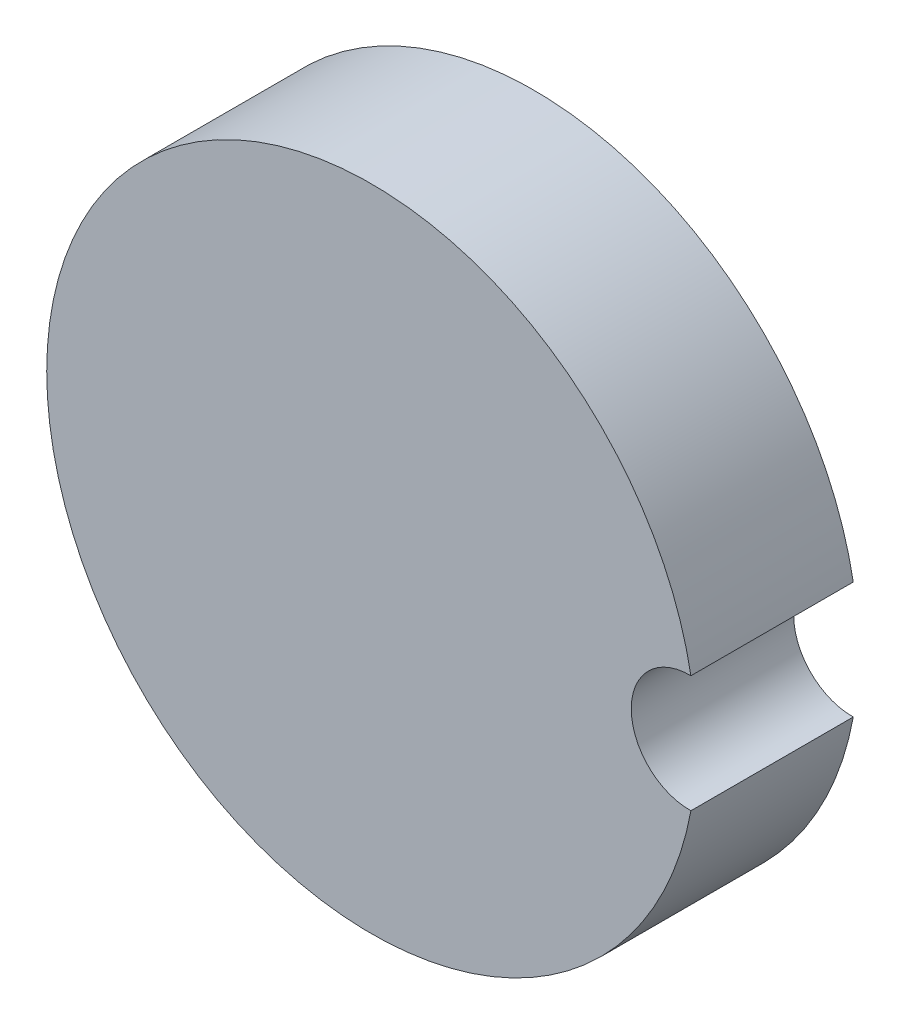
ISO-10303-21;
HEADER;
FILE_DESCRIPTION(('STEP AP214'),'2;1');
FILE_NAME('part.step','',(''),(''),'','','');
FILE_SCHEMA(('AUTOMOTIVE_DESIGN { 1 0 10303 214 1 1 1 1 }'));
ENDSEC;
DATA;
#1=APPLICATION_CONTEXT('core data for automotive mechanical design processes');
#2=APPLICATION_PROTOCOL_DEFINITION('international standard','automotive_design',2000,#1);
#3=PRODUCT_CONTEXT('',#1,'mechanical');
#4=PRODUCT('Part','Part','',(#3));
#5=PRODUCT_RELATED_PRODUCT_CATEGORY('part','',(#4));
#6=PRODUCT_DEFINITION_FORMATION('','',#4);
#7=PRODUCT_DEFINITION_CONTEXT('part definition',#1,'design');
#8=PRODUCT_DEFINITION('design','',#6,#7);
#9=PRODUCT_DEFINITION_SHAPE('','',#8);
#10=(LENGTH_UNIT() NAMED_UNIT(*) SI_UNIT(.MILLI.,.METRE.));
#11=(NAMED_UNIT(*) PLANE_ANGLE_UNIT() SI_UNIT($,.RADIAN.));
#12=(NAMED_UNIT(*) SI_UNIT($,.STERADIAN.) SOLID_ANGLE_UNIT());
#13=UNCERTAINTY_MEASURE_WITH_UNIT(LENGTH_MEASURE(1.E-05),#10,'distance_accuracy_value','');
#14=(GEOMETRIC_REPRESENTATION_CONTEXT(3) GLOBAL_UNCERTAINTY_ASSIGNED_CONTEXT((#13)) GLOBAL_UNIT_ASSIGNED_CONTEXT((#10,
#11,#12)) REPRESENTATION_CONTEXT('',''));
#15=CARTESIAN_POINT('',(0.,0.,0.));
#16=DIRECTION('',(0.,0.,1.));
#17=DIRECTION('',(1.,0.,0.));
#18=AXIS2_PLACEMENT_3D('',#15,#16,#17);
#19=CARTESIAN_POINT('',(0.,0.,50.));
#20=DIRECTION('',(0.,0.,-1.));
#21=DIRECTION('',(-1.,0.,0.));
#22=AXIS2_PLACEMENT_3D('',#19,#20,#21);
#23=CYLINDRICAL_SURFACE('',#22,100.);
#24=CARTESIAN_POINT('',(0.,0.,0.));
#25=DIRECTION('',(0.,0.,1.));
#26=DIRECTION('',(1.,0.,0.));
#27=AXIS2_PLACEMENT_3D('',#24,#25,#26);
#28=CIRCLE('',#27,100.);
#29=CARTESIAN_POINT('',(98.3673469387755,17.9962511714683,0.));
#30=VERTEX_POINT('',#29);
#31=CARTESIAN_POINT('',(98.3673469387755,-17.9962511714683,0.));
#32=VERTEX_POINT('',#31);
#33=EDGE_CURVE('E45',#30,#32,#28,.T.);
#34=ORIENTED_EDGE('',*,*,#33,.T.);
#35=DIRECTION('',(0.,0.,1.));
#36=VECTOR('',#35,1.);
#37=CARTESIAN_POINT('',(98.3673469387755,-17.9962511714683,25.));
#38=LINE('',#37,#36);
#39=CARTESIAN_POINT('',(98.3673469387755,-17.9962511714683,50.));
#40=VERTEX_POINT('',#39);
#41=EDGE_CURVE('E61',#32,#40,#38,.T.);
#42=ORIENTED_EDGE('',*,*,#41,.T.);
#43=CARTESIAN_POINT('',(0.,0.,50.));
#44=DIRECTION('',(0.,0.,1.));
#45=DIRECTION('',(1.,0.,0.));
#46=AXIS2_PLACEMENT_3D('',#43,#44,#45);
#47=CIRCLE('',#46,100.);
#48=CARTESIAN_POINT('',(98.3673469387755,17.9962511714683,50.));
#49=VERTEX_POINT('',#48);
#50=EDGE_CURVE('E11',#49,#40,#47,.T.);
#51=ORIENTED_EDGE('',*,*,#50,.F.);
#52=DIRECTION('',(0.,0.,1.));
#53=VECTOR('',#52,1.);
#54=CARTESIAN_POINT('',(98.3673469387755,17.9962511714683,25.));
#55=LINE('',#54,#53);
#56=EDGE_CURVE('E66',#49,#30,#55,.F.);
#57=ORIENTED_EDGE('',*,*,#56,.T.);
#58=EDGE_LOOP('',(#34,#42,#51,#57));
#59=FACE_BOUND('',#58,.T.);
#60=ADVANCED_FACE('F39',(#59),#23,.T.);
#61=CARTESIAN_POINT('',(0.,0.,50.));
#62=DIRECTION('',(0.,0.,1.));
#63=DIRECTION('',(1.,0.,0.));
#64=AXIS2_PLACEMENT_3D('',#61,#62,#63);
#65=PLANE('',#64);
#66=CARTESIAN_POINT('',(98.,0.,50.));
#67=DIRECTION('',(0.,0.,1.));
#68=DIRECTION('',(1.,0.,0.));
#69=AXIS2_PLACEMENT_3D('',#66,#67,#68);
#70=CIRCLE('',#69,18.);
#71=EDGE_CURVE('E59',#49,#40,#70,.T.);
#72=ORIENTED_EDGE('',*,*,#71,.F.);
#73=ORIENTED_EDGE('',*,*,#50,.T.);
#74=EDGE_LOOP('',(#72,#73));
#75=FACE_BOUND('',#74,.T.);
#76=ADVANCED_FACE('F77',(#75),#65,.T.);
#77=CARTESIAN_POINT('',(0.,0.,0.));
#78=DIRECTION('',(0.,0.,1.));
#79=DIRECTION('',(1.,0.,0.));
#80=AXIS2_PLACEMENT_3D('',#77,#78,#79);
#81=PLANE('',#80);
#82=ORIENTED_EDGE('',*,*,#33,.F.);
#83=CARTESIAN_POINT('',(98.,0.,0.));
#84=DIRECTION('',(0.,0.,1.));
#85=DIRECTION('',(1.,0.,0.));
#86=AXIS2_PLACEMENT_3D('',#83,#84,#85);
#87=CIRCLE('',#86,18.);
#88=EDGE_CURVE('E52',#30,#32,#87,.T.);
#89=ORIENTED_EDGE('',*,*,#88,.T.);
#90=EDGE_LOOP('',(#82,#89));
#91=FACE_BOUND('',#90,.T.);
#92=ADVANCED_FACE('F75',(#91),#81,.F.);
#93=CARTESIAN_POINT('',(98.,0.,0.));
#94=DIRECTION('',(0.,0.,1.));
#95=DIRECTION('',(1.,0.,0.));
#96=AXIS2_PLACEMENT_3D('',#93,#94,#95);
#97=CYLINDRICAL_SURFACE('',#96,18.);
#98=ORIENTED_EDGE('',*,*,#88,.F.);
#99=ORIENTED_EDGE('',*,*,#56,.F.);
#100=ORIENTED_EDGE('',*,*,#71,.T.);
#101=ORIENTED_EDGE('',*,*,#41,.F.);
#102=EDGE_LOOP('',(#98,#99,#100,#101));
#103=FACE_BOUND('',#102,.T.);
#104=ADVANCED_FACE('F62',(#103),#97,.F.);
#105=CLOSED_SHELL('',(#60,#76,#92,#104));
#106=MANIFOLD_SOLID_BREP('B2',#105);
#107=ADVANCED_BREP_SHAPE_REPRESENTATION('',(#18,#106),#14);
#108=SHAPE_DEFINITION_REPRESENTATION(#9,#107);
ENDSEC;
END-ISO-10303-21;
